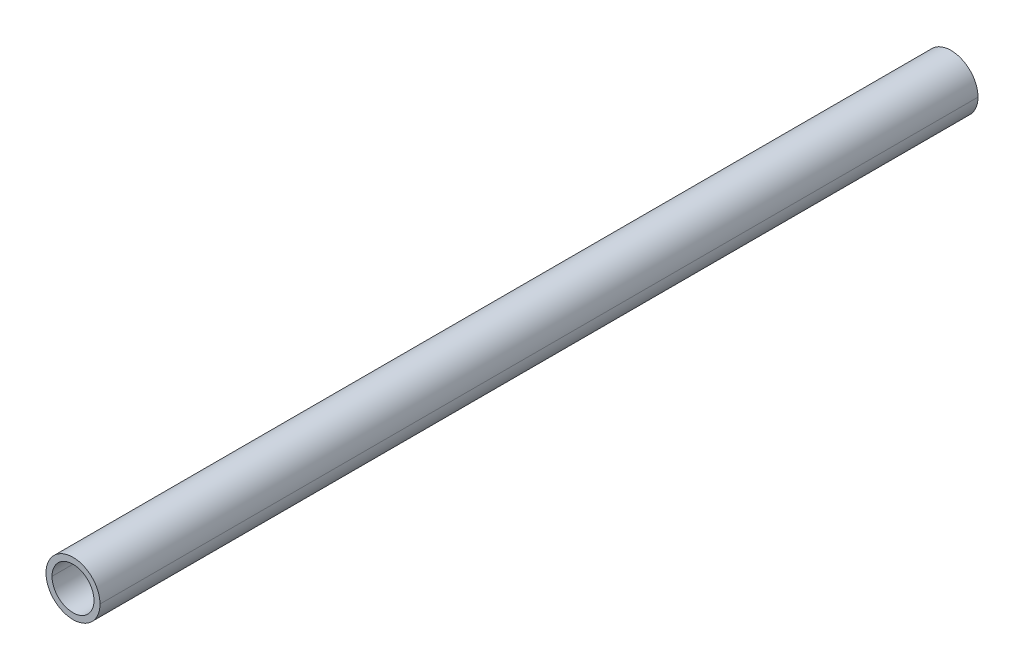
ISO-10303-21;
HEADER;
FILE_DESCRIPTION(('STEP AP214'),'2;1');
FILE_NAME('part.step','',(''),(''),'','','');
FILE_SCHEMA(('AUTOMOTIVE_DESIGN { 1 0 10303 214 1 1 1 1 }'));
ENDSEC;
DATA;
#1=APPLICATION_CONTEXT('core data for automotive mechanical design processes');
#2=APPLICATION_PROTOCOL_DEFINITION('international standard','automotive_design',2000,#1);
#3=PRODUCT_CONTEXT('',#1,'mechanical');
#4=PRODUCT('Part','Part','',(#3));
#5=PRODUCT_RELATED_PRODUCT_CATEGORY('part','',(#4));
#6=PRODUCT_DEFINITION_FORMATION('','',#4);
#7=PRODUCT_DEFINITION_CONTEXT('part definition',#1,'design');
#8=PRODUCT_DEFINITION('design','',#6,#7);
#9=PRODUCT_DEFINITION_SHAPE('','',#8);
#10=(LENGTH_UNIT() NAMED_UNIT(*) SI_UNIT(.MILLI.,.METRE.));
#11=(NAMED_UNIT(*) PLANE_ANGLE_UNIT() SI_UNIT($,.RADIAN.));
#12=(NAMED_UNIT(*) SI_UNIT($,.STERADIAN.) SOLID_ANGLE_UNIT());
#13=UNCERTAINTY_MEASURE_WITH_UNIT(LENGTH_MEASURE(1.E-05),#10,'distance_accuracy_value','');
#14=(GEOMETRIC_REPRESENTATION_CONTEXT(3) GLOBAL_UNCERTAINTY_ASSIGNED_CONTEXT((#13)) GLOBAL_UNIT_ASSIGNED_CONTEXT((#10,
#11,#12)) REPRESENTATION_CONTEXT('',''));
#15=CARTESIAN_POINT('',(0.,0.,0.));
#16=DIRECTION('',(0.,0.,1.));
#17=DIRECTION('',(1.,0.,0.));
#18=AXIS2_PLACEMENT_3D('',#15,#16,#17);
#19=CARTESIAN_POINT('',(0.,0.,292.66));
#20=DIRECTION('',(0.,0.,-1.));
#21=DIRECTION('',(-1.,0.,0.));
#22=AXIS2_PLACEMENT_3D('',#19,#20,#21);
#23=CYLINDRICAL_SURFACE('',#22,7.);
#24=DIRECTION('',(0.,0.,-1.));
#25=VECTOR('',#24,1.);
#26=CARTESIAN_POINT('',(7.,0.,292.66));
#27=LINE('',#26,#25);
#28=CARTESIAN_POINT('',(7.,0.,292.66));
#29=VERTEX_POINT('',#28);
#30=CARTESIAN_POINT('',(7.,0.,0.));
#31=VERTEX_POINT('',#30);
#32=EDGE_CURVE('E96',#29,#31,#27,.T.);
#33=ORIENTED_EDGE('',*,*,#32,.F.);
#34=CARTESIAN_POINT('',(0.,0.,292.66));
#35=DIRECTION('',(0.,0.,1.));
#36=DIRECTION('',(1.,0.,0.));
#37=AXIS2_PLACEMENT_3D('',#34,#35,#36);
#38=CIRCLE('',#37,7.);
#39=CARTESIAN_POINT('',(-7.,0.,292.66));
#40=VERTEX_POINT('',#39);
#41=EDGE_CURVE('E74',#29,#40,#38,.T.);
#42=ORIENTED_EDGE('',*,*,#41,.T.);
#43=DIRECTION('',(0.,0.,-1.));
#44=VECTOR('',#43,1.);
#45=CARTESIAN_POINT('',(-7.,0.,292.66));
#46=LINE('',#45,#44);
#47=CARTESIAN_POINT('',(-7.,0.,0.));
#48=VERTEX_POINT('',#47);
#49=EDGE_CURVE('E85',#40,#48,#46,.T.);
#50=ORIENTED_EDGE('',*,*,#49,.T.);
#51=CARTESIAN_POINT('',(0.,0.,0.));
#52=DIRECTION('',(0.,0.,1.));
#53=DIRECTION('',(1.,0.,0.));
#54=AXIS2_PLACEMENT_3D('',#51,#52,#53);
#55=CIRCLE('',#54,7.);
#56=EDGE_CURVE('E11',#31,#48,#55,.T.);
#57=ORIENTED_EDGE('',*,*,#56,.F.);
#58=EDGE_LOOP('',(#33,#42,#50,#57));
#59=FACE_BOUND('',#58,.T.);
#60=ADVANCED_FACE('F16',(#59),#23,.F.);
#61=CARTESIAN_POINT('',(0.,0.,292.66));
#62=DIRECTION('',(0.,0.,-1.));
#63=DIRECTION('',(-1.,0.,0.));
#64=AXIS2_PLACEMENT_3D('',#61,#62,#63);
#65=CYLINDRICAL_SURFACE('',#64,9.);
#66=DIRECTION('',(0.,0.,-1.));
#67=VECTOR('',#66,1.);
#68=CARTESIAN_POINT('',(9.,0.,292.66));
#69=LINE('',#68,#67);
#70=CARTESIAN_POINT('',(9.,0.,292.66));
#71=VERTEX_POINT('',#70);
#72=CARTESIAN_POINT('',(9.,0.,0.));
#73=VERTEX_POINT('',#72);
#74=EDGE_CURVE('E77',#71,#73,#69,.T.);
#75=ORIENTED_EDGE('',*,*,#74,.F.);
#76=CARTESIAN_POINT('',(0.,0.,292.66));
#77=DIRECTION('',(0.,0.,1.));
#78=DIRECTION('',(1.,0.,0.));
#79=AXIS2_PLACEMENT_3D('',#76,#77,#78);
#80=CIRCLE('',#79,9.);
#81=CARTESIAN_POINT('',(-9.,0.,292.66));
#82=VERTEX_POINT('',#81);
#83=EDGE_CURVE('E63',#82,#71,#80,.T.);
#84=ORIENTED_EDGE('',*,*,#83,.F.);
#85=DIRECTION('',(0.,0.,-1.));
#86=VECTOR('',#85,1.);
#87=CARTESIAN_POINT('',(-9.,0.,292.66));
#88=LINE('',#87,#86);
#89=CARTESIAN_POINT('',(-9.,0.,0.));
#90=VERTEX_POINT('',#89);
#91=EDGE_CURVE('E20',#82,#90,#88,.T.);
#92=ORIENTED_EDGE('',*,*,#91,.T.);
#93=CARTESIAN_POINT('',(0.,0.,0.));
#94=DIRECTION('',(0.,0.,1.));
#95=DIRECTION('',(1.,0.,0.));
#96=AXIS2_PLACEMENT_3D('',#93,#94,#95);
#97=CIRCLE('',#96,9.);
#98=EDGE_CURVE('E27',#90,#73,#97,.T.);
#99=ORIENTED_EDGE('',*,*,#98,.T.);
#100=EDGE_LOOP('',(#75,#84,#92,#99));
#101=FACE_BOUND('',#100,.T.);
#102=ADVANCED_FACE('F78',(#101),#65,.T.);
#103=CARTESIAN_POINT('',(0.,0.,0.));
#104=DIRECTION('',(0.,0.,1.));
#105=DIRECTION('',(1.,0.,0.));
#106=AXIS2_PLACEMENT_3D('',#103,#104,#105);
#107=PLANE('',#106);
#108=CARTESIAN_POINT('',(0.,0.,0.));
#109=DIRECTION('',(0.,0.,1.));
#110=DIRECTION('',(1.,0.,0.));
#111=AXIS2_PLACEMENT_3D('',#108,#109,#110);
#112=CIRCLE('',#111,7.);
#113=EDGE_CURVE('E92',#48,#31,#112,.T.);
#114=ORIENTED_EDGE('',*,*,#113,.T.);
#115=ORIENTED_EDGE('',*,*,#56,.T.);
#116=EDGE_LOOP('',(#114,#115));
#117=FACE_BOUND('',#116,.T.);
#118=ORIENTED_EDGE('',*,*,#98,.F.);
#119=CARTESIAN_POINT('',(0.,0.,0.));
#120=DIRECTION('',(0.,0.,1.));
#121=DIRECTION('',(1.,0.,0.));
#122=AXIS2_PLACEMENT_3D('',#119,#120,#121);
#123=CIRCLE('',#122,9.);
#124=EDGE_CURVE('E82',#73,#90,#123,.T.);
#125=ORIENTED_EDGE('',*,*,#124,.F.);
#126=EDGE_LOOP('',(#118,#125));
#127=FACE_BOUND('',#126,.T.);
#128=ADVANCED_FACE('F126',(#117,#127),#107,.F.);
#129=CARTESIAN_POINT('',(0.,0.,292.66));
#130=DIRECTION('',(0.,0.,1.));
#131=DIRECTION('',(1.,0.,0.));
#132=AXIS2_PLACEMENT_3D('',#129,#130,#131);
#133=PLANE('',#132);
#134=CARTESIAN_POINT('',(0.,0.,292.66));
#135=DIRECTION('',(0.,0.,1.));
#136=DIRECTION('',(1.,0.,0.));
#137=AXIS2_PLACEMENT_3D('',#134,#135,#136);
#138=CIRCLE('',#137,7.);
#139=EDGE_CURVE('E99',#40,#29,#138,.T.);
#140=ORIENTED_EDGE('',*,*,#139,.F.);
#141=ORIENTED_EDGE('',*,*,#41,.F.);
#142=EDGE_LOOP('',(#140,#141));
#143=FACE_BOUND('',#142,.T.);
#144=ORIENTED_EDGE('',*,*,#83,.T.);
#145=CARTESIAN_POINT('',(0.,0.,292.66));
#146=DIRECTION('',(0.,0.,1.));
#147=DIRECTION('',(1.,0.,0.));
#148=AXIS2_PLACEMENT_3D('',#145,#146,#147);
#149=CIRCLE('',#148,9.);
#150=EDGE_CURVE('E72',#71,#82,#149,.T.);
#151=ORIENTED_EDGE('',*,*,#150,.T.);
#152=EDGE_LOOP('',(#144,#151));
#153=FACE_BOUND('',#152,.T.);
#154=ADVANCED_FACE('F70',(#143,#153),#133,.T.);
#155=CARTESIAN_POINT('',(0.,0.,292.66));
#156=DIRECTION('',(0.,0.,-1.));
#157=DIRECTION('',(-1.,0.,0.));
#158=AXIS2_PLACEMENT_3D('',#155,#156,#157);
#159=CYLINDRICAL_SURFACE('',#158,9.);
#160=ORIENTED_EDGE('',*,*,#150,.F.);
#161=ORIENTED_EDGE('',*,*,#74,.T.);
#162=ORIENTED_EDGE('',*,*,#124,.T.);
#163=ORIENTED_EDGE('',*,*,#91,.F.);
#164=EDGE_LOOP('',(#160,#161,#162,#163));
#165=FACE_BOUND('',#164,.T.);
#166=ADVANCED_FACE('F18',(#165),#159,.T.);
#167=CARTESIAN_POINT('',(0.,0.,292.66));
#168=DIRECTION('',(0.,0.,-1.));
#169=DIRECTION('',(-1.,0.,0.));
#170=AXIS2_PLACEMENT_3D('',#167,#168,#169);
#171=CYLINDRICAL_SURFACE('',#170,7.);
#172=ORIENTED_EDGE('',*,*,#139,.T.);
#173=ORIENTED_EDGE('',*,*,#32,.T.);
#174=ORIENTED_EDGE('',*,*,#113,.F.);
#175=ORIENTED_EDGE('',*,*,#49,.F.);
#176=EDGE_LOOP('',(#172,#173,#174,#175));
#177=FACE_BOUND('',#176,.T.);
#178=ADVANCED_FACE('F158',(#177),#171,.F.);
#179=CLOSED_SHELL('',(#60,#102,#128,#154,#166,#178));
#180=MANIFOLD_SOLID_BREP('B1',#179);
#181=ADVANCED_BREP_SHAPE_REPRESENTATION('',(#18,#180),#14);
#182=SHAPE_DEFINITION_REPRESENTATION(#9,#181);
ENDSEC;
END-ISO-10303-21;
